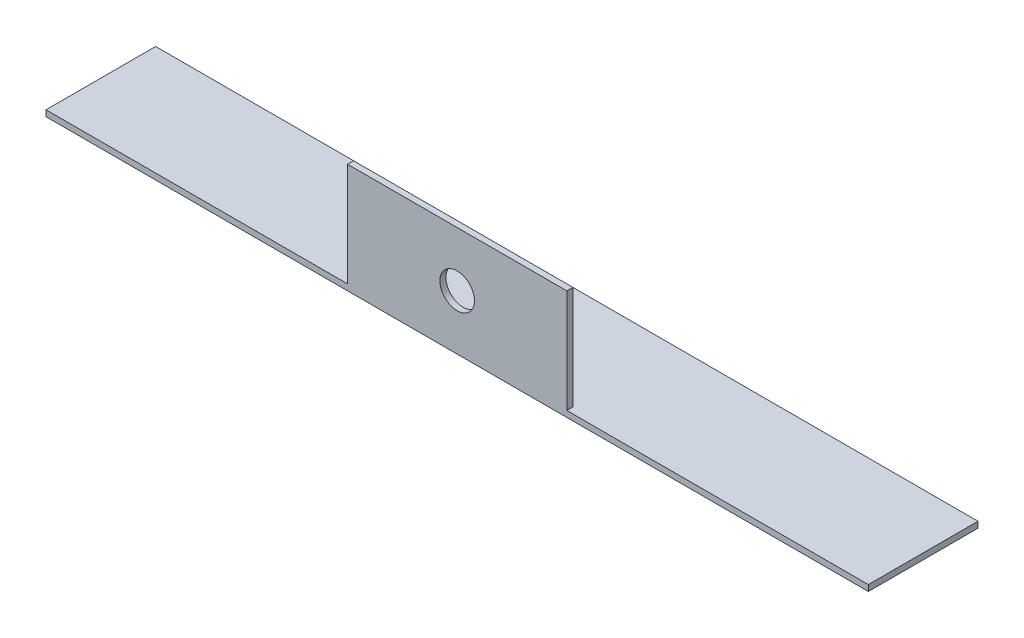
ISO-10303-21;
HEADER;
FILE_DESCRIPTION(('STEP AP214'),'2;1');
FILE_NAME('part.step','',(''),(''),'','','');
FILE_SCHEMA(('AUTOMOTIVE_DESIGN { 1 0 10303 214 1 1 1 1 }'));
ENDSEC;
DATA;
#1=APPLICATION_CONTEXT('core data for automotive mechanical design processes');
#2=APPLICATION_PROTOCOL_DEFINITION('international standard','automotive_design',2000,#1);
#3=PRODUCT_CONTEXT('',#1,'mechanical');
#4=PRODUCT('Part','Part','',(#3));
#5=PRODUCT_RELATED_PRODUCT_CATEGORY('part','',(#4));
#6=PRODUCT_DEFINITION_FORMATION('','',#4);
#7=PRODUCT_DEFINITION_CONTEXT('part definition',#1,'design');
#8=PRODUCT_DEFINITION('design','',#6,#7);
#9=PRODUCT_DEFINITION_SHAPE('','',#8);
#10=(LENGTH_UNIT() NAMED_UNIT(*) SI_UNIT(.MILLI.,.METRE.));
#11=(NAMED_UNIT(*) PLANE_ANGLE_UNIT() SI_UNIT($,.RADIAN.));
#12=(NAMED_UNIT(*) SI_UNIT($,.STERADIAN.) SOLID_ANGLE_UNIT());
#13=UNCERTAINTY_MEASURE_WITH_UNIT(LENGTH_MEASURE(1.E-05),#10,'distance_accuracy_value','');
#14=(GEOMETRIC_REPRESENTATION_CONTEXT(3) GLOBAL_UNCERTAINTY_ASSIGNED_CONTEXT((#13)) GLOBAL_UNIT_ASSIGNED_CONTEXT((#10,
#11,#12)) REPRESENTATION_CONTEXT('',''));
#15=CARTESIAN_POINT('',(0.,0.,0.));
#16=DIRECTION('',(0.,0.,1.));
#17=DIRECTION('',(1.,0.,0.));
#18=AXIS2_PLACEMENT_3D('',#15,#16,#17);
#19=CARTESIAN_POINT('',(190.5,2.794,-25.4));
#20=DIRECTION('',(-1.,0.,0.));
#21=DIRECTION('',(0.,0.,1.));
#22=AXIS2_PLACEMENT_3D('',#19,#20,#21);
#23=PLANE('',#22);
#24=DIRECTION('',(0.,0.,-1.));
#25=VECTOR('',#24,1.);
#26=CARTESIAN_POINT('',(190.5,2.794,-25.4));
#27=LINE('',#26,#25);
#28=CARTESIAN_POINT('',(190.5,2.794,25.4));
#29=VERTEX_POINT('',#28);
#30=CARTESIAN_POINT('',(190.5,2.794,-25.4));
#31=VERTEX_POINT('',#30);
#32=EDGE_CURVE('E127',#29,#31,#27,.T.);
#33=ORIENTED_EDGE('',*,*,#32,.F.);
#34=DIRECTION('',(0.,-1.,0.));
#35=VECTOR('',#34,1.);
#36=CARTESIAN_POINT('',(190.5,2.794,25.4));
#37=LINE('',#36,#35);
#38=CARTESIAN_POINT('',(190.5,0.,25.4));
#39=VERTEX_POINT('',#38);
#40=EDGE_CURVE('E109',#29,#39,#37,.T.);
#41=ORIENTED_EDGE('',*,*,#40,.T.);
#42=DIRECTION('',(0.,0.,-1.));
#43=VECTOR('',#42,1.);
#44=CARTESIAN_POINT('',(190.5,0.,-25.4));
#45=LINE('',#44,#43);
#46=CARTESIAN_POINT('',(190.5,0.,-25.4));
#47=VERTEX_POINT('',#46);
#48=EDGE_CURVE('E131',#39,#47,#45,.T.);
#49=ORIENTED_EDGE('',*,*,#48,.T.);
#50=DIRECTION('',(0.,-1.,0.));
#51=VECTOR('',#50,1.);
#52=CARTESIAN_POINT('',(190.5,2.794,-25.4));
#53=LINE('',#52,#51);
#54=EDGE_CURVE('E11',#31,#47,#53,.T.);
#55=ORIENTED_EDGE('',*,*,#54,.F.);
#56=EDGE_LOOP('',(#33,#41,#49,#55));
#57=FACE_BOUND('',#56,.T.);
#58=ADVANCED_FACE('F33',(#57),#23,.F.);
#59=CARTESIAN_POINT('',(-190.5,2.794,-25.4));
#60=DIRECTION('',(0.,0.,1.));
#61=DIRECTION('',(1.,0.,0.));
#62=AXIS2_PLACEMENT_3D('',#59,#60,#61);
#63=PLANE('',#62);
#64=DIRECTION('',(-1.,0.,0.));
#65=VECTOR('',#64,1.);
#66=CARTESIAN_POINT('',(-190.5,0.,-25.4));
#67=LINE('',#66,#65);
#68=CARTESIAN_POINT('',(-190.5,0.,-25.4));
#69=VERTEX_POINT('',#68);
#70=EDGE_CURVE('E129',#47,#69,#67,.T.);
#71=ORIENTED_EDGE('',*,*,#70,.T.);
#72=DIRECTION('',(0.,-1.,0.));
#73=VECTOR('',#72,1.);
#74=CARTESIAN_POINT('',(-190.5,2.794,-25.4));
#75=LINE('',#74,#73);
#76=CARTESIAN_POINT('',(-190.5,2.794,-25.4));
#77=VERTEX_POINT('',#76);
#78=EDGE_CURVE('E40',#77,#69,#75,.T.);
#79=ORIENTED_EDGE('',*,*,#78,.F.);
#80=DIRECTION('',(-1.,0.,0.));
#81=VECTOR('',#80,1.);
#82=CARTESIAN_POINT('',(-190.5,2.794,-25.4));
#83=LINE('',#82,#81);
#84=EDGE_CURVE('E104',#31,#77,#83,.T.);
#85=ORIENTED_EDGE('',*,*,#84,.F.);
#86=ORIENTED_EDGE('',*,*,#54,.T.);
#87=EDGE_LOOP('',(#71,#79,#85,#86));
#88=FACE_BOUND('',#87,.T.);
#89=ADVANCED_FACE('F182',(#88),#63,.F.);
#90=CARTESIAN_POINT('',(-190.5,2.794,-25.4));
#91=DIRECTION('',(1.,0.,0.));
#92=DIRECTION('',(0.,0.,-1.));
#93=AXIS2_PLACEMENT_3D('',#90,#91,#92);
#94=PLANE('',#93);
#95=DIRECTION('',(0.,-1.,0.));
#96=VECTOR('',#95,1.);
#97=CARTESIAN_POINT('',(-190.5,2.794,25.4));
#98=LINE('',#97,#96);
#99=CARTESIAN_POINT('',(-190.5,2.794,25.4));
#100=VERTEX_POINT('',#99);
#101=CARTESIAN_POINT('',(-190.5,0.,25.4));
#102=VERTEX_POINT('',#101);
#103=EDGE_CURVE('E115',#100,#102,#98,.T.);
#104=ORIENTED_EDGE('',*,*,#103,.F.);
#105=DIRECTION('',(0.,0.,1.));
#106=VECTOR('',#105,1.);
#107=CARTESIAN_POINT('',(-190.5,2.794,-25.4));
#108=LINE('',#107,#106);
#109=EDGE_CURVE('E97',#77,#100,#108,.T.);
#110=ORIENTED_EDGE('',*,*,#109,.F.);
#111=ORIENTED_EDGE('',*,*,#78,.T.);
#112=DIRECTION('',(0.,0.,1.));
#113=VECTOR('',#112,1.);
#114=CARTESIAN_POINT('',(-190.5,0.,-25.4));
#115=LINE('',#114,#113);
#116=EDGE_CURVE('E120',#69,#102,#115,.T.);
#117=ORIENTED_EDGE('',*,*,#116,.T.);
#118=EDGE_LOOP('',(#104,#110,#111,#117));
#119=FACE_BOUND('',#118,.T.);
#120=ADVANCED_FACE('F118',(#119),#94,.F.);
#121=CARTESIAN_POINT('',(-190.5,2.794,25.4));
#122=DIRECTION('',(0.,0.,-1.));
#123=DIRECTION('',(-1.,0.,0.));
#124=AXIS2_PLACEMENT_3D('',#121,#122,#123);
#125=PLANE('',#124);
#126=CARTESIAN_POINT('',(0.,25.4,25.4));
#127=DIRECTION('',(0.,0.,1.));
#128=DIRECTION('',(1.,0.,0.));
#129=AXIS2_PLACEMENT_3D('',#126,#127,#128);
#130=CIRCLE('',#129,8.);
#131=CARTESIAN_POINT('',(8.,25.4,25.4));
#132=VERTEX_POINT('',#131);
#133=EDGE_CURVE('E148',#132,#132,#130,.T.);
#134=ORIENTED_EDGE('',*,*,#133,.F.);
#135=EDGE_LOOP('',(#134));
#136=FACE_BOUND('',#135,.T.);
#137=DIRECTION('',(1.,0.,0.));
#138=VECTOR('',#137,1.);
#139=CARTESIAN_POINT('',(-190.5,50.8,25.4));
#140=LINE('',#139,#138);
#141=CARTESIAN_POINT('',(-50.8,50.8,25.4));
#142=VERTEX_POINT('',#141);
#143=CARTESIAN_POINT('',(50.8,50.8,25.4));
#144=VERTEX_POINT('',#143);
#145=EDGE_CURVE('E140',#142,#144,#140,.T.);
#146=ORIENTED_EDGE('',*,*,#145,.F.);
#147=DIRECTION('',(0.,1.,0.));
#148=VECTOR('',#147,1.);
#149=CARTESIAN_POINT('',(-50.8,50.8,25.4));
#150=LINE('',#149,#148);
#151=CARTESIAN_POINT('',(-50.8,2.794,25.4));
#152=VERTEX_POINT('',#151);
#153=EDGE_CURVE('E55',#152,#142,#150,.T.);
#154=ORIENTED_EDGE('',*,*,#153,.F.);
#155=DIRECTION('',(1.,0.,0.));
#156=VECTOR('',#155,1.);
#157=CARTESIAN_POINT('',(-190.5,2.794,25.4));
#158=LINE('',#157,#156);
#159=EDGE_CURVE('E102',#100,#152,#158,.T.);
#160=ORIENTED_EDGE('',*,*,#159,.F.);
#161=ORIENTED_EDGE('',*,*,#103,.T.);
#162=DIRECTION('',(1.,0.,0.));
#163=VECTOR('',#162,1.);
#164=CARTESIAN_POINT('',(-190.5,0.,25.4));
#165=LINE('',#164,#163);
#166=EDGE_CURVE('E125',#102,#39,#165,.T.);
#167=ORIENTED_EDGE('',*,*,#166,.T.);
#168=ORIENTED_EDGE('',*,*,#40,.F.);
#169=DIRECTION('',(1.,0.,0.));
#170=VECTOR('',#169,1.);
#171=CARTESIAN_POINT('',(190.5,2.794,25.4));
#172=LINE('',#171,#170);
#173=CARTESIAN_POINT('',(50.8,2.79399999999998,25.4));
#174=VERTEX_POINT('',#173);
#175=EDGE_CURVE('E155',#174,#29,#172,.T.);
#176=ORIENTED_EDGE('',*,*,#175,.F.);
#177=DIRECTION('',(0.,-1.,0.));
#178=VECTOR('',#177,1.);
#179=CARTESIAN_POINT('',(50.8,50.8,25.4));
#180=LINE('',#179,#178);
#181=EDGE_CURVE('E159',#144,#174,#180,.T.);
#182=ORIENTED_EDGE('',*,*,#181,.F.);
#183=EDGE_LOOP('',(#146,#154,#160,#161,#167,#168,#176,#182));
#184=FACE_BOUND('',#183,.T.);
#185=ADVANCED_FACE('F113',(#136,#184),#125,.F.);
#186=CARTESIAN_POINT('',(0.,2.794,0.));
#187=DIRECTION('',(0.,1.,0.));
#188=DIRECTION('',(0.,0.,1.));
#189=AXIS2_PLACEMENT_3D('',#186,#187,#188);
#190=PLANE('',#189);
#191=DIRECTION('',(-1.,0.,0.));
#192=VECTOR('',#191,1.);
#193=CARTESIAN_POINT('',(-190.5,2.794,22.606));
#194=LINE('',#193,#192);
#195=CARTESIAN_POINT('',(50.8,2.79399999999998,22.606));
#196=VERTEX_POINT('',#195);
#197=CARTESIAN_POINT('',(-50.8,2.794,22.6059999999999));
#198=VERTEX_POINT('',#197);
#199=EDGE_CURVE('E137',#196,#198,#194,.T.);
#200=ORIENTED_EDGE('',*,*,#199,.F.);
#201=DIRECTION('',(0.,0.,1.));
#202=VECTOR('',#201,1.);
#203=CARTESIAN_POINT('',(50.8,2.79399999999998,-125.112198052914));
#204=LINE('',#203,#202);
#205=EDGE_CURVE('E154',#196,#174,#204,.T.);
#206=ORIENTED_EDGE('',*,*,#205,.T.);
#207=ORIENTED_EDGE('',*,*,#175,.T.);
#208=ORIENTED_EDGE('',*,*,#32,.T.);
#209=ORIENTED_EDGE('',*,*,#84,.T.);
#210=ORIENTED_EDGE('',*,*,#109,.T.);
#211=ORIENTED_EDGE('',*,*,#159,.T.);
#212=DIRECTION('',(0.,0.,1.));
#213=VECTOR('',#212,1.);
#214=CARTESIAN_POINT('',(-50.8,2.794,-125.112198052914));
#215=LINE('',#214,#213);
#216=EDGE_CURVE('E163',#198,#152,#215,.T.);
#217=ORIENTED_EDGE('',*,*,#216,.F.);
#218=EDGE_LOOP('',(#200,#206,#207,#208,#209,#210,#211,#217));
#219=FACE_BOUND('',#218,.T.);
#220=ADVANCED_FACE('F100',(#219),#190,.T.);
#221=CARTESIAN_POINT('',(0.,0.,0.));
#222=DIRECTION('',(0.,1.,0.));
#223=DIRECTION('',(0.,0.,1.));
#224=AXIS2_PLACEMENT_3D('',#221,#222,#223);
#225=PLANE('',#224);
#226=ORIENTED_EDGE('',*,*,#48,.F.);
#227=ORIENTED_EDGE('',*,*,#166,.F.);
#228=ORIENTED_EDGE('',*,*,#116,.F.);
#229=ORIENTED_EDGE('',*,*,#70,.F.);
#230=EDGE_LOOP('',(#226,#227,#228,#229));
#231=FACE_BOUND('',#230,.T.);
#232=ADVANCED_FACE('F185',(#231),#225,.F.);
#233=CARTESIAN_POINT('',(-190.5,50.8,22.606));
#234=DIRECTION('',(0.,0.,1.));
#235=DIRECTION('',(1.,0.,0.));
#236=AXIS2_PLACEMENT_3D('',#233,#234,#235);
#237=PLANE('',#236);
#238=CARTESIAN_POINT('',(0.,25.4,22.606));
#239=DIRECTION('',(0.,0.,1.));
#240=DIRECTION('',(1.,0.,0.));
#241=AXIS2_PLACEMENT_3D('',#238,#239,#240);
#242=CIRCLE('',#241,8.);
#243=CARTESIAN_POINT('',(8.,25.4,22.606));
#244=VERTEX_POINT('',#243);
#245=EDGE_CURVE('E141',#244,#244,#242,.F.);
#246=ORIENTED_EDGE('',*,*,#245,.F.);
#247=EDGE_LOOP('',(#246));
#248=FACE_BOUND('',#247,.T.);
#249=ORIENTED_EDGE('',*,*,#199,.T.);
#250=DIRECTION('',(0.,-1.,0.));
#251=VECTOR('',#250,1.);
#252=CARTESIAN_POINT('',(-50.8,50.8,22.606));
#253=LINE('',#252,#251);
#254=CARTESIAN_POINT('',(-50.8,50.8,22.606));
#255=VERTEX_POINT('',#254);
#256=EDGE_CURVE('E151',#255,#198,#253,.T.);
#257=ORIENTED_EDGE('',*,*,#256,.F.);
#258=DIRECTION('',(-1.,0.,0.));
#259=VECTOR('',#258,1.);
#260=CARTESIAN_POINT('',(-190.5,50.8,22.606));
#261=LINE('',#260,#259);
#262=CARTESIAN_POINT('',(50.8,50.8,22.606));
#263=VERTEX_POINT('',#262);
#264=EDGE_CURVE('E133',#263,#255,#261,.T.);
#265=ORIENTED_EDGE('',*,*,#264,.F.);
#266=DIRECTION('',(0.,1.,0.));
#267=VECTOR('',#266,1.);
#268=CARTESIAN_POINT('',(50.8,50.8,22.606));
#269=LINE('',#268,#267);
#270=EDGE_CURVE('E47',#196,#263,#269,.T.);
#271=ORIENTED_EDGE('',*,*,#270,.F.);
#272=EDGE_LOOP('',(#249,#257,#265,#271));
#273=FACE_BOUND('',#272,.T.);
#274=ADVANCED_FACE('F172',(#248,#273),#237,.F.);
#275=CARTESIAN_POINT('',(0.,50.8,0.));
#276=DIRECTION('',(0.,-1.,0.));
#277=DIRECTION('',(0.,0.,-1.));
#278=AXIS2_PLACEMENT_3D('',#275,#276,#277);
#279=PLANE('',#278);
#280=ORIENTED_EDGE('',*,*,#264,.T.);
#281=DIRECTION('',(0.,0.,1.));
#282=VECTOR('',#281,1.);
#283=CARTESIAN_POINT('',(-50.8,50.8,-125.112198052914));
#284=LINE('',#283,#282);
#285=EDGE_CURVE('E165',#255,#142,#284,.T.);
#286=ORIENTED_EDGE('',*,*,#285,.T.);
#287=ORIENTED_EDGE('',*,*,#145,.T.);
#288=DIRECTION('',(0.,0.,1.));
#289=VECTOR('',#288,1.);
#290=CARTESIAN_POINT('',(50.8,50.8,-125.112198052914));
#291=LINE('',#290,#289);
#292=EDGE_CURVE('E152',#263,#144,#291,.T.);
#293=ORIENTED_EDGE('',*,*,#292,.F.);
#294=EDGE_LOOP('',(#280,#286,#287,#293));
#295=FACE_BOUND('',#294,.T.);
#296=ADVANCED_FACE('F174',(#295),#279,.F.);
#297=CARTESIAN_POINT('',(0.,25.4,-0.0214169979695367));
#298=DIRECTION('',(0.,0.,1.));
#299=DIRECTION('',(1.,0.,0.));
#300=AXIS2_PLACEMENT_3D('',#297,#298,#299);
#301=CYLINDRICAL_SURFACE('',#300,8.);
#302=ORIENTED_EDGE('',*,*,#245,.T.);
#303=EDGE_LOOP('',(#302));
#304=FACE_BOUND('',#303,.T.);
#305=ORIENTED_EDGE('',*,*,#133,.T.);
#306=EDGE_LOOP('',(#305));
#307=FACE_BOUND('',#306,.T.);
#308=ADVANCED_FACE('F210',(#304,#307),#301,.F.);
#309=CARTESIAN_POINT('',(50.8,50.8,-125.112198052914));
#310=DIRECTION('',(-1.,0.,0.));
#311=DIRECTION('',(0.,0.,1.));
#312=AXIS2_PLACEMENT_3D('',#309,#310,#311);
#313=PLANE('',#312);
#314=ORIENTED_EDGE('',*,*,#270,.T.);
#315=ORIENTED_EDGE('',*,*,#292,.T.);
#316=ORIENTED_EDGE('',*,*,#181,.T.);
#317=ORIENTED_EDGE('',*,*,#205,.F.);
#318=EDGE_LOOP('',(#314,#315,#316,#317));
#319=FACE_BOUND('',#318,.T.);
#320=ADVANCED_FACE('F176',(#319),#313,.F.);
#321=CARTESIAN_POINT('',(-50.8,50.8,-125.112198052914));
#322=DIRECTION('',(1.,0.,0.));
#323=DIRECTION('',(0.,0.,-1.));
#324=AXIS2_PLACEMENT_3D('',#321,#322,#323);
#325=PLANE('',#324);
#326=ORIENTED_EDGE('',*,*,#256,.T.);
#327=ORIENTED_EDGE('',*,*,#216,.T.);
#328=ORIENTED_EDGE('',*,*,#153,.T.);
#329=ORIENTED_EDGE('',*,*,#285,.F.);
#330=EDGE_LOOP('',(#326,#327,#328,#329));
#331=FACE_BOUND('',#330,.T.);
#332=ADVANCED_FACE('F169',(#331),#325,.F.);
#333=CLOSED_SHELL('',(#58,#89,#120,#185,#220,#232,#274,#296,#308,#320,#332));
#334=MANIFOLD_SOLID_BREP('B2',#333);
#335=ADVANCED_BREP_SHAPE_REPRESENTATION('',(#18,#334),#14);
#336=SHAPE_DEFINITION_REPRESENTATION(#9,#335);
ENDSEC;
END-ISO-10303-21;
